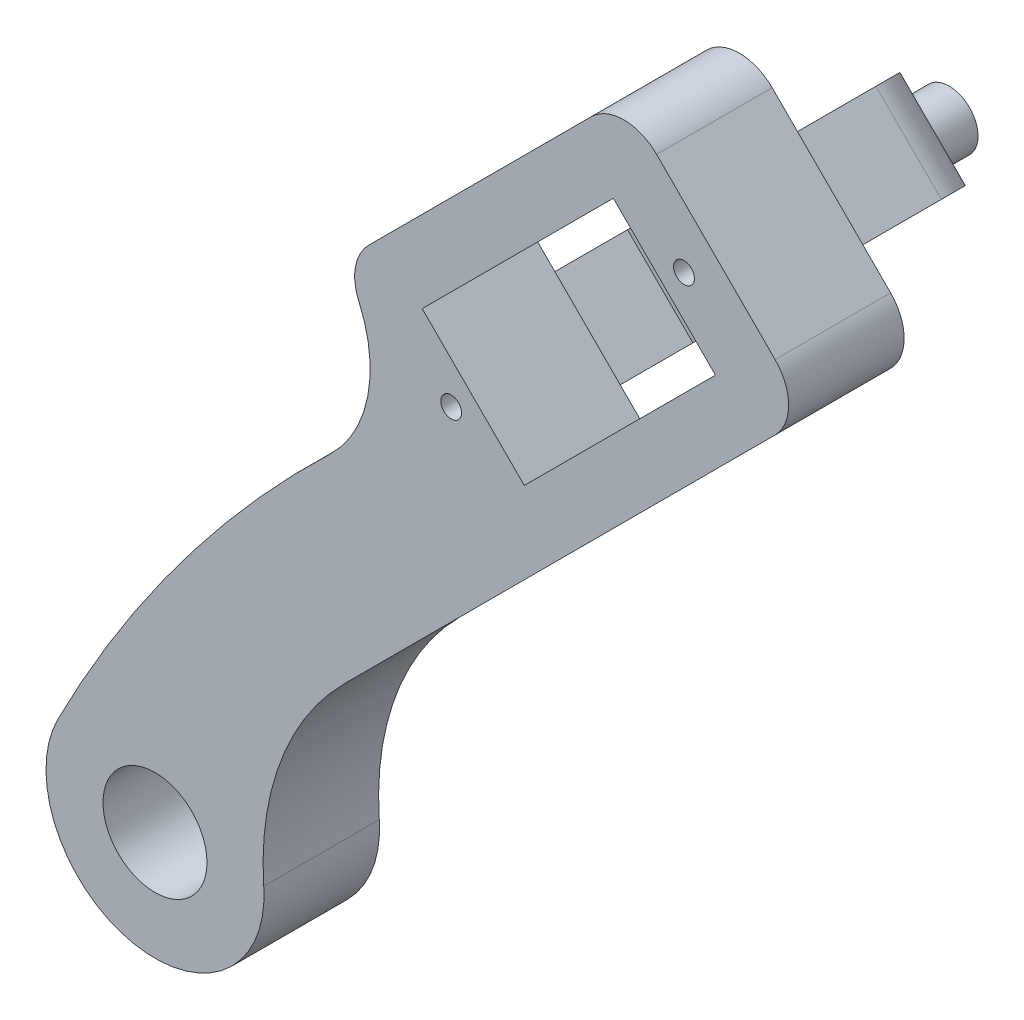
ISO-10303-21;
HEADER;
FILE_DESCRIPTION(('STEP AP214'),'2;1');
FILE_NAME('part.step','',(''),(''),'','','');
FILE_SCHEMA(('AUTOMOTIVE_DESIGN { 1 0 10303 214 1 1 1 1 }'));
ENDSEC;
DATA;
#1=APPLICATION_CONTEXT('core data for automotive mechanical design processes');
#2=APPLICATION_PROTOCOL_DEFINITION('international standard','automotive_design',2000,#1);
#3=PRODUCT_CONTEXT('',#1,'mechanical');
#4=PRODUCT('Part','Part','',(#3));
#5=PRODUCT_RELATED_PRODUCT_CATEGORY('part','',(#4));
#6=PRODUCT_DEFINITION_FORMATION('','',#4);
#7=PRODUCT_DEFINITION_CONTEXT('part definition',#1,'design');
#8=PRODUCT_DEFINITION('design','',#6,#7);
#9=PRODUCT_DEFINITION_SHAPE('','',#8);
#10=(LENGTH_UNIT() NAMED_UNIT(*) SI_UNIT(.MILLI.,.METRE.));
#11=(NAMED_UNIT(*) PLANE_ANGLE_UNIT() SI_UNIT($,.RADIAN.));
#12=(NAMED_UNIT(*) SI_UNIT($,.STERADIAN.) SOLID_ANGLE_UNIT());
#13=UNCERTAINTY_MEASURE_WITH_UNIT(LENGTH_MEASURE(1.E-05),#10,'distance_accuracy_value','');
#14=(GEOMETRIC_REPRESENTATION_CONTEXT(3) GLOBAL_UNCERTAINTY_ASSIGNED_CONTEXT((#13)) GLOBAL_UNIT_ASSIGNED_CONTEXT((#10,
#11,#12)) REPRESENTATION_CONTEXT('',''));
#15=CARTESIAN_POINT('',(0.,0.,0.));
#16=DIRECTION('',(0.,0.,1.));
#17=DIRECTION('',(1.,0.,0.));
#18=AXIS2_PLACEMENT_3D('',#15,#16,#17);
#19=CARTESIAN_POINT('',(24.0811143897357,-32.5956416867762,10.));
#20=DIRECTION('',(0.,0.,-1.));
#21=DIRECTION('',(-1.,0.,0.));
#22=AXIS2_PLACEMENT_3D('',#19,#20,#21);
#23=PLANE('',#22);
#24=CARTESIAN_POINT('',(36.5069999718094,29.9101868637243,10.));
#25=DIRECTION('',(0.,0.,1.));
#26=DIRECTION('',(1.,0.,0.));
#27=AXIS2_PLACEMENT_3D('',#24,#25,#26);
#28=CIRCLE('',#27,0.899999999999996);
#29=CARTESIAN_POINT('',(37.4069999718094,29.9101868637243,10.));
#30=VERTEX_POINT('',#29);
#31=EDGE_CURVE('E846',#30,#30,#28,.T.);
#32=ORIENTED_EDGE('',*,*,#31,.F.);
#33=EDGE_LOOP('',(#32));
#34=FACE_BOUND('',#33,.T.);
#35=CARTESIAN_POINT('',(16.3544567079928,9.75764359990767,10.));
#36=DIRECTION('',(0.,0.,1.));
#37=DIRECTION('',(1.,0.,0.));
#38=AXIS2_PLACEMENT_3D('',#35,#36,#37);
#39=CIRCLE('',#38,0.9);
#40=CARTESIAN_POINT('',(17.2544567079928,9.75764359990767,10.));
#41=VERTEX_POINT('',#40);
#42=EDGE_CURVE('E855',#41,#41,#39,.T.);
#43=ORIENTED_EDGE('',*,*,#42,.F.);
#44=EDGE_LOOP('',(#43));
#45=FACE_BOUND('',#44,.T.);
#46=CARTESIAN_POINT('',(24.0811143897357,-32.5956416867762,10.));
#47=DIRECTION('',(0.,0.,-1.));
#48=DIRECTION('',(-1.,0.,0.));
#49=AXIS2_PLACEMENT_3D('',#46,#47,#48);
#50=CIRCLE('',#49,24.0118672744103);
#51=CARTESIAN_POINT('',(0.129369861392694,-34.2937889280073,10.));
#52=VERTEX_POINT('',#51);
#53=CARTESIAN_POINT('',(7.10216021104856,-15.61668750809,10.));
#54=VERTEX_POINT('',#53);
#55=EDGE_CURVE('E372',#52,#54,#50,.T.);
#56=ORIENTED_EDGE('',*,*,#55,.T.);
#57=DIRECTION('',(0.707106781186546,0.707106781186549,0.));
#58=VECTOR('',#57,1.);
#59=CARTESIAN_POINT('',(7.10216021104856,-15.61668750809,10.));
#60=LINE('',#59,#58);
#61=CARTESIAN_POINT('',(44.3912405820395,21.6723928629011,10.));
#62=VERTEX_POINT('',#61);
#63=EDGE_CURVE('E376',#54,#62,#60,.T.);
#64=ORIENTED_EDGE('',*,*,#63,.T.);
#65=CARTESIAN_POINT('',(41.5628134572933,24.5008199876474,10.));
#66=DIRECTION('',(0.,0.,1.));
#67=DIRECTION('',(1.,0.,0.));
#68=AXIS2_PLACEMENT_3D('',#65,#66,#67);
#69=CIRCLE('',#68,3.9999999999999);
#70=CARTESIAN_POINT('',(44.3912405820395,27.3292471123935,10.));
#71=VERTEX_POINT('',#70);
#72=EDGE_CURVE('E380',#62,#71,#69,.T.);
#73=ORIENTED_EDGE('',*,*,#72,.T.);
#74=DIRECTION('',(-0.707106781186549,0.707106781186546,0.));
#75=VECTOR('',#74,1.);
#76=CARTESIAN_POINT('',(44.3912405820394,27.3292471123934,10.));
#77=LINE('',#76,#75);
#78=CARTESIAN_POINT('',(34.1381922548344,37.5822954395984,10.));
#79=VERTEX_POINT('',#78);
#80=EDGE_CURVE('E383',#71,#79,#77,.T.);
#81=ORIENTED_EDGE('',*,*,#80,.T.);
#82=CARTESIAN_POINT('',(31.3097651300883,34.7538683148522,10.));
#83=DIRECTION('',(0.,0.,1.));
#84=DIRECTION('',(1.,0.,0.));
#85=AXIS2_PLACEMENT_3D('',#82,#83,#84);
#86=CIRCLE('',#85,3.99999999999996);
#87=CARTESIAN_POINT('',(28.481338005342,37.5822954395983,10.));
#88=VERTEX_POINT('',#87);
#89=EDGE_CURVE('E386',#79,#88,#86,.T.);
#90=ORIENTED_EDGE('',*,*,#89,.T.);
#91=DIRECTION('',(-0.707106781186546,-0.707106781186549,0.));
#92=VECTOR('',#91,1.);
#93=CARTESIAN_POINT('',(28.481338005342,37.5822954395983,10.));
#94=LINE('',#93,#92);
#95=CARTESIAN_POINT('',(9.21539039948496,18.3163478337412,10.));
#96=VERTEX_POINT('',#95);
#97=EDGE_CURVE('E389',#88,#96,#94,.T.);
#98=ORIENTED_EDGE('',*,*,#97,.T.);
#99=CARTESIAN_POINT('',(12.1521017138168,15.3796365194093,10.));
#100=DIRECTION('',(0.,0.,1.));
#101=DIRECTION('',(1.,0.,0.));
#102=AXIS2_PLACEMENT_3D('',#99,#100,#101);
#103=CIRCLE('',#102,4.15313696950266);
#104=CARTESIAN_POINT('',(8.36213667163491,13.6811926238129,10.));
#105=VERTEX_POINT('',#104);
#106=EDGE_CURVE('E392',#96,#105,#103,.T.);
#107=ORIENTED_EDGE('',*,*,#106,.T.);
#108=CARTESIAN_POINT('',(-1.86752605487324,9.09684738092259,10.));
#109=DIRECTION('',(0.,0.,-1.));
#110=DIRECTION('',(-1.,0.,0.));
#111=AXIS2_PLACEMENT_3D('',#108,#109,#110);
#112=CIRCLE('',#111,11.2099161818509);
#113=CARTESIAN_POINT('',(5.88617447944661,1.00102445621569,10.));
#114=VERTEX_POINT('',#113);
#115=EDGE_CURVE('E395',#105,#114,#112,.T.);
#116=ORIENTED_EDGE('',*,*,#115,.T.);
#117=CARTESIAN_POINT('',(87.9841446707318,-84.7194165389705,10.));
#118=DIRECTION('',(0.,0.,1.));
#119=DIRECTION('',(1.,0.,0.));
#120=AXIS2_PLACEMENT_3D('',#117,#118,#119);
#121=CIRCLE('',#120,118.693178885471);
#122=CARTESIAN_POINT('',(-17.6852254719046,-30.6633814679737,10.));
#123=VERTEX_POINT('',#122);
#124=EDGE_CURVE('E398',#114,#123,#121,.T.);
#125=ORIENTED_EDGE('',*,*,#124,.T.);
#126=CARTESIAN_POINT('',(-9.28385052519776,-34.9611738949632,10.));
#127=DIRECTION('',(0.,0.,1.));
#128=DIRECTION('',(1.,0.,0.));
#129=AXIS2_PLACEMENT_3D('',#126,#127,#128);
#130=CIRCLE('',#129,9.43684908964008);
#131=EDGE_CURVE('E401',#123,#52,#130,.T.);
#132=ORIENTED_EDGE('',*,*,#131,.T.);
#133=EDGE_LOOP('',(#56,#64,#73,#81,#90,#98,#107,#116,#125,#132));
#134=FACE_BOUND('',#133,.T.);
#135=DIRECTION('',(-0.707106781186549,0.707106781186546,0.));
#136=VECTOR('',#135,1.);
#137=CARTESIAN_POINT('',(39.2293610793776,23.5815811721047,10.));
#138=LINE('',#137,#136);
#139=CARTESIAN_POINT('',(39.2293610793776,23.5815811721047,10.));
#140=VERTEX_POINT('',#139);
#141=CARTESIAN_POINT('',(30.3905263145457,32.4204159369365,10.));
#142=VERTEX_POINT('',#141);
#143=EDGE_CURVE('E329',#140,#142,#138,.T.);
#144=ORIENTED_EDGE('',*,*,#143,.F.);
#145=DIRECTION('',(0.707106781186546,0.707106781186549,0.));
#146=VECTOR('',#145,1.);
#147=CARTESIAN_POINT('',(39.2293610793776,23.5815811721047,10.));
#148=LINE('',#147,#146);
#149=CARTESIAN_POINT('',(22.6830623996124,7.03528249233946,10.));
#150=VERTEX_POINT('',#149);
#151=EDGE_CURVE('E340',#150,#140,#148,.T.);
#152=ORIENTED_EDGE('',*,*,#151,.F.);
#153=DIRECTION('',(0.707106781186549,-0.707106781186546,0.));
#154=VECTOR('',#153,1.);
#155=CARTESIAN_POINT('',(22.6830623996124,7.03528249233946,10.));
#156=LINE('',#155,#154);
#157=CARTESIAN_POINT('',(13.8442276347806,15.8741172571713,10.));
#158=VERTEX_POINT('',#157);
#159=EDGE_CURVE('E336',#158,#150,#156,.T.);
#160=ORIENTED_EDGE('',*,*,#159,.F.);
#161=DIRECTION('',(-0.707106781186546,-0.707106781186549,0.));
#162=VECTOR('',#161,1.);
#163=CARTESIAN_POINT('',(30.3905263145457,32.4204159369365,10.));
#164=LINE('',#163,#162);
#165=EDGE_CURVE('E332',#142,#158,#164,.T.);
#166=ORIENTED_EDGE('',*,*,#165,.F.);
#167=EDGE_LOOP('',(#144,#152,#160,#166));
#168=FACE_BOUND('',#167,.T.);
#169=CARTESIAN_POINT('',(-9.28385052519776,-34.9611738949632,10.));
#170=DIRECTION('',(0.,0.,1.));
#171=DIRECTION('',(1.,0.,0.));
#172=AXIS2_PLACEMENT_3D('',#169,#170,#171);
#173=CIRCLE('',#172,4.5);
#174=CARTESIAN_POINT('',(-4.78385052519776,-34.9611738949632,10.));
#175=VERTEX_POINT('',#174);
#176=EDGE_CURVE('E321',#175,#175,#173,.T.);
#177=ORIENTED_EDGE('',*,*,#176,.F.);
#178=EDGE_LOOP('',(#177));
#179=FACE_BOUND('',#178,.T.);
#180=ADVANCED_FACE('F41',(#34,#45,#134,#168,#179),#23,.F.);
#181=CARTESIAN_POINT('',(24.0811143897357,-32.5956416867762,0.));
#182=DIRECTION('',(0.,0.,-1.));
#183=DIRECTION('',(-1.,0.,0.));
#184=AXIS2_PLACEMENT_3D('',#181,#182,#183);
#185=PLANE('',#184);
#186=DIRECTION('',(0.707106781186546,0.707106781186549,0.));
#187=VECTOR('',#186,1.);
#188=CARTESIAN_POINT('',(6.12683367878881,-6.12683367878878,0.));
#189=LINE('',#188,#187);
#190=CARTESIAN_POINT('',(38.6636756544284,26.4100082968509,0.));
#191=VERTEX_POINT('',#190);
#192=CARTESIAN_POINT('',(40.784995997988,28.5313286404105,0.));
#193=VERTEX_POINT('',#192);
#194=EDGE_CURVE('E235',#191,#193,#189,.T.);
#195=ORIENTED_EDGE('',*,*,#194,.T.);
#196=DIRECTION('',(-0.707106781186549,0.707106781186546,0.));
#197=VECTOR('',#196,1.);
#198=CARTESIAN_POINT('',(40.784995997988,28.5313286404105,0.));
#199=LINE('',#198,#197);
#200=CARTESIAN_POINT('',(35.1281417484956,34.1881828899029,0.));
#201=VERTEX_POINT('',#200);
#202=EDGE_CURVE('E218',#193,#201,#199,.T.);
#203=ORIENTED_EDGE('',*,*,#202,.T.);
#204=DIRECTION('',(0.707106781186546,0.707106781186549,0.));
#205=VECTOR('',#204,1.);
#206=CARTESIAN_POINT('',(0.469979429296419,-0.469979429296418,0.));
#207=LINE('',#206,#205);
#208=CARTESIAN_POINT('',(33.006821404936,32.0668625463433,0.));
#209=VERTEX_POINT('',#208);
#210=EDGE_CURVE('E270',#209,#201,#207,.T.);
#211=ORIENTED_EDGE('',*,*,#210,.F.);
#212=DIRECTION('',(-0.707106781186549,0.707106781186546,0.));
#213=VECTOR('',#212,1.);
#214=CARTESIAN_POINT('',(38.6636756544284,26.4100082968509,0.));
#215=LINE('',#214,#213);
#216=EDGE_CURVE('E316',#191,#209,#215,.T.);
#217=ORIENTED_EDGE('',*,*,#216,.F.);
#218=EDGE_LOOP('',(#195,#203,#211,#217));
#219=FACE_BOUND('',#218,.T.);
#220=DIRECTION('',(-0.707106781186546,-0.707106781186549,0.));
#221=VECTOR('',#220,1.);
#222=CARTESIAN_POINT('',(6.12683367878881,-6.12683367878878,0.));
#223=LINE('',#222,#221);
#224=CARTESIAN_POINT('',(20.2788993435782,8.02523198600062,0.));
#225=VERTEX_POINT('',#224);
#226=CARTESIAN_POINT('',(18.1575790000185,5.90391164244098,0.));
#227=VERTEX_POINT('',#226);
#228=EDGE_CURVE('E250',#225,#227,#223,.T.);
#229=ORIENTED_EDGE('',*,*,#228,.F.);
#230=DIRECTION('',(-0.707106781186549,0.707106781186546,0.));
#231=VECTOR('',#230,1.);
#232=CARTESIAN_POINT('',(20.2788993435782,8.02523198600062,0.));
#233=LINE('',#232,#231);
#234=CARTESIAN_POINT('',(14.6220450940858,13.682086235493,0.));
#235=VERTEX_POINT('',#234);
#236=EDGE_CURVE('E304',#225,#235,#233,.T.);
#237=ORIENTED_EDGE('',*,*,#236,.T.);
#238=DIRECTION('',(-0.707106781186546,-0.707106781186549,0.));
#239=VECTOR('',#238,1.);
#240=CARTESIAN_POINT('',(0.469979429296419,-0.469979429296418,0.));
#241=LINE('',#240,#239);
#242=CARTESIAN_POINT('',(12.5007247505261,11.5607658919333,0.));
#243=VERTEX_POINT('',#242);
#244=EDGE_CURVE('E281',#235,#243,#241,.T.);
#245=ORIENTED_EDGE('',*,*,#244,.T.);
#246=DIRECTION('',(-0.707106781186549,0.707106781186546,0.));
#247=VECTOR('',#246,1.);
#248=CARTESIAN_POINT('',(18.1575790000185,5.90391164244098,0.));
#249=LINE('',#248,#247);
#250=EDGE_CURVE('E301',#227,#243,#249,.T.);
#251=ORIENTED_EDGE('',*,*,#250,.F.);
#252=EDGE_LOOP('',(#229,#237,#245,#251));
#253=FACE_BOUND('',#252,.T.);
#254=DIRECTION('',(0.707106781186546,0.707106781186549,0.));
#255=VECTOR('',#254,1.);
#256=CARTESIAN_POINT('',(39.2293610793776,23.5815811721047,0.));
#257=LINE('',#256,#255);
#258=CARTESIAN_POINT('',(22.6830623996124,7.03528249233946,0.));
#259=VERTEX_POINT('',#258);
#260=CARTESIAN_POINT('',(39.2293610793776,23.5815811721047,0.));
#261=VERTEX_POINT('',#260);
#262=EDGE_CURVE('E333',#259,#261,#257,.T.);
#263=ORIENTED_EDGE('',*,*,#262,.T.);
#264=DIRECTION('',(-0.707106781186549,0.707106781186546,0.));
#265=VECTOR('',#264,1.);
#266=CARTESIAN_POINT('',(39.2293610793776,23.5815811721047,0.));
#267=LINE('',#266,#265);
#268=CARTESIAN_POINT('',(30.3905263145457,32.4204159369365,0.));
#269=VERTEX_POINT('',#268);
#270=EDGE_CURVE('E325',#261,#269,#267,.T.);
#271=ORIENTED_EDGE('',*,*,#270,.T.);
#272=DIRECTION('',(-0.707106781186546,-0.707106781186549,0.));
#273=VECTOR('',#272,1.);
#274=CARTESIAN_POINT('',(30.3905263145457,32.4204159369365,0.));
#275=LINE('',#274,#273);
#276=CARTESIAN_POINT('',(13.8442276347806,15.8741172571713,0.));
#277=VERTEX_POINT('',#276);
#278=EDGE_CURVE('E347',#269,#277,#275,.T.);
#279=ORIENTED_EDGE('',*,*,#278,.T.);
#280=DIRECTION('',(0.707106781186549,-0.707106781186546,0.));
#281=VECTOR('',#280,1.);
#282=CARTESIAN_POINT('',(22.6830623996124,7.03528249233946,0.));
#283=LINE('',#282,#281);
#284=EDGE_CURVE('E351',#277,#259,#283,.T.);
#285=ORIENTED_EDGE('',*,*,#284,.T.);
#286=EDGE_LOOP('',(#263,#271,#279,#285));
#287=FACE_BOUND('',#286,.T.);
#288=CARTESIAN_POINT('',(24.0811143897357,-32.5956416867762,0.));
#289=DIRECTION('',(0.,0.,-1.));
#290=DIRECTION('',(-1.,0.,0.));
#291=AXIS2_PLACEMENT_3D('',#288,#289,#290);
#292=CIRCLE('',#291,24.0118672744103);
#293=CARTESIAN_POINT('',(0.129369861392694,-34.2937889280073,0.));
#294=VERTEX_POINT('',#293);
#295=CARTESIAN_POINT('',(7.10216021104856,-15.61668750809,0.));
#296=VERTEX_POINT('',#295);
#297=EDGE_CURVE('E371',#294,#296,#292,.T.);
#298=ORIENTED_EDGE('',*,*,#297,.F.);
#299=CARTESIAN_POINT('',(-9.28385052519776,-34.9611738949632,0.));
#300=DIRECTION('',(0.,0.,1.));
#301=DIRECTION('',(1.,0.,0.));
#302=AXIS2_PLACEMENT_3D('',#299,#300,#301);
#303=CIRCLE('',#302,9.43684908964008);
#304=CARTESIAN_POINT('',(-17.6852254719046,-30.6633814679737,0.));
#305=VERTEX_POINT('',#304);
#306=EDGE_CURVE('E377',#305,#294,#303,.T.);
#307=ORIENTED_EDGE('',*,*,#306,.F.);
#308=CARTESIAN_POINT('',(87.9841446707318,-84.7194165389705,0.));
#309=DIRECTION('',(0.,0.,1.));
#310=DIRECTION('',(1.,0.,0.));
#311=AXIS2_PLACEMENT_3D('',#308,#309,#310);
#312=CIRCLE('',#311,118.693178885471);
#313=CARTESIAN_POINT('',(5.88617447944661,1.00102445621569,0.));
#314=VERTEX_POINT('',#313);
#315=EDGE_CURVE('E429',#314,#305,#312,.T.);
#316=ORIENTED_EDGE('',*,*,#315,.F.);
#317=CARTESIAN_POINT('',(-1.86752605487324,9.09684738092259,0.));
#318=DIRECTION('',(0.,0.,-1.));
#319=DIRECTION('',(-1.,0.,0.));
#320=AXIS2_PLACEMENT_3D('',#317,#318,#319);
#321=CIRCLE('',#320,11.2099161818509);
#322=CARTESIAN_POINT('',(8.36213667163491,13.6811926238129,0.));
#323=VERTEX_POINT('',#322);
#324=EDGE_CURVE('E426',#323,#314,#321,.T.);
#325=ORIENTED_EDGE('',*,*,#324,.F.);
#326=CARTESIAN_POINT('',(12.1521017138168,15.3796365194093,0.));
#327=DIRECTION('',(0.,0.,1.));
#328=DIRECTION('',(1.,0.,0.));
#329=AXIS2_PLACEMENT_3D('',#326,#327,#328);
#330=CIRCLE('',#329,4.15313696950266);
#331=CARTESIAN_POINT('',(9.21539039948496,18.3163478337412,0.));
#332=VERTEX_POINT('',#331);
#333=EDGE_CURVE('E423',#332,#323,#330,.T.);
#334=ORIENTED_EDGE('',*,*,#333,.F.);
#335=DIRECTION('',(-0.707106781186546,-0.707106781186549,0.));
#336=VECTOR('',#335,1.);
#337=CARTESIAN_POINT('',(28.481338005342,37.5822954395983,0.));
#338=LINE('',#337,#336);
#339=CARTESIAN_POINT('',(28.481338005342,37.5822954395983,0.));
#340=VERTEX_POINT('',#339);
#341=EDGE_CURVE('E420',#340,#332,#338,.T.);
#342=ORIENTED_EDGE('',*,*,#341,.F.);
#343=CARTESIAN_POINT('',(31.3097651300883,34.7538683148522,0.));
#344=DIRECTION('',(0.,0.,1.));
#345=DIRECTION('',(1.,0.,0.));
#346=AXIS2_PLACEMENT_3D('',#343,#344,#345);
#347=CIRCLE('',#346,3.99999999999996);
#348=CARTESIAN_POINT('',(34.1381922548344,37.5822954395984,0.));
#349=VERTEX_POINT('',#348);
#350=EDGE_CURVE('E417',#349,#340,#347,.T.);
#351=ORIENTED_EDGE('',*,*,#350,.F.);
#352=DIRECTION('',(-0.707106781186549,0.707106781186546,0.));
#353=VECTOR('',#352,1.);
#354=CARTESIAN_POINT('',(44.3912405820394,27.3292471123934,0.));
#355=LINE('',#354,#353);
#356=CARTESIAN_POINT('',(44.3912405820395,27.3292471123935,0.));
#357=VERTEX_POINT('',#356);
#358=EDGE_CURVE('E414',#357,#349,#355,.T.);
#359=ORIENTED_EDGE('',*,*,#358,.F.);
#360=CARTESIAN_POINT('',(41.5628134572933,24.5008199876474,0.));
#361=DIRECTION('',(0.,0.,1.));
#362=DIRECTION('',(1.,0.,0.));
#363=AXIS2_PLACEMENT_3D('',#360,#361,#362);
#364=CIRCLE('',#363,3.9999999999999);
#365=CARTESIAN_POINT('',(44.3912405820395,21.6723928629011,0.));
#366=VERTEX_POINT('',#365);
#367=EDGE_CURVE('E411',#366,#357,#364,.T.);
#368=ORIENTED_EDGE('',*,*,#367,.F.);
#369=DIRECTION('',(0.707106781186546,0.707106781186549,0.));
#370=VECTOR('',#369,1.);
#371=CARTESIAN_POINT('',(7.10216021104856,-15.61668750809,0.));
#372=LINE('',#371,#370);
#373=EDGE_CURVE('E408',#296,#366,#372,.T.);
#374=ORIENTED_EDGE('',*,*,#373,.F.);
#375=EDGE_LOOP('',(#298,#307,#316,#325,#334,#342,#351,#359,#368,#374));
#376=FACE_BOUND('',#375,.T.);
#377=CARTESIAN_POINT('',(-9.28385052519776,-34.9611738949632,0.));
#378=DIRECTION('',(0.,0.,1.));
#379=DIRECTION('',(1.,0.,0.));
#380=AXIS2_PLACEMENT_3D('',#377,#378,#379);
#381=CIRCLE('',#380,4.5);
#382=CARTESIAN_POINT('',(-4.78385052519776,-34.9611738949632,0.));
#383=VERTEX_POINT('',#382);
#384=EDGE_CURVE('E217',#383,#383,#381,.T.);
#385=ORIENTED_EDGE('',*,*,#384,.T.);
#386=EDGE_LOOP('',(#385));
#387=FACE_BOUND('',#386,.T.);
#388=ADVANCED_FACE('F482',(#219,#253,#287,#376,#387),#185,.T.);
#389=CARTESIAN_POINT('',(24.0811143897357,-32.5956416867762,10.));
#390=DIRECTION('',(0.,0.,-1.));
#391=DIRECTION('',(-1.,0.,0.));
#392=AXIS2_PLACEMENT_3D('',#389,#390,#391);
#393=CYLINDRICAL_SURFACE('',#392,24.0118672744103);
#394=ORIENTED_EDGE('',*,*,#297,.T.);
#395=DIRECTION('',(0.,0.,-1.));
#396=VECTOR('',#395,1.);
#397=CARTESIAN_POINT('',(7.10216021104856,-15.61668750809,10.));
#398=LINE('',#397,#396);
#399=EDGE_CURVE('E45',#54,#296,#398,.T.);
#400=ORIENTED_EDGE('',*,*,#399,.F.);
#401=ORIENTED_EDGE('',*,*,#55,.F.);
#402=DIRECTION('',(0.,0.,-1.));
#403=VECTOR('',#402,1.);
#404=CARTESIAN_POINT('',(0.129369861392694,-34.2937889280073,10.));
#405=LINE('',#404,#403);
#406=EDGE_CURVE('E404',#52,#294,#405,.T.);
#407=ORIENTED_EDGE('',*,*,#406,.T.);
#408=EDGE_LOOP('',(#394,#400,#401,#407));
#409=FACE_BOUND('',#408,.T.);
#410=ADVANCED_FACE('F43',(#409),#393,.F.);
#411=CARTESIAN_POINT('',(7.10216021104856,-15.61668750809,10.));
#412=DIRECTION('',(-0.707106781186549,0.707106781186546,0.));
#413=DIRECTION('',(-0.707106781186546,-0.707106781186549,0.));
#414=AXIS2_PLACEMENT_3D('',#411,#412,#413);
#415=PLANE('',#414);
#416=ORIENTED_EDGE('',*,*,#373,.T.);
#417=DIRECTION('',(0.,0.,-1.));
#418=VECTOR('',#417,1.);
#419=CARTESIAN_POINT('',(44.3912405820395,21.6723928629011,10.));
#420=LINE('',#419,#418);
#421=EDGE_CURVE('E464',#62,#366,#420,.T.);
#422=ORIENTED_EDGE('',*,*,#421,.F.);
#423=ORIENTED_EDGE('',*,*,#63,.F.);
#424=ORIENTED_EDGE('',*,*,#399,.T.);
#425=EDGE_LOOP('',(#416,#422,#423,#424));
#426=FACE_BOUND('',#425,.T.);
#427=ADVANCED_FACE('F475',(#426),#415,.F.);
#428=CARTESIAN_POINT('',(41.5628134572933,24.5008199876474,10.));
#429=DIRECTION('',(0.,0.,-1.));
#430=DIRECTION('',(-1.,0.,0.));
#431=AXIS2_PLACEMENT_3D('',#428,#429,#430);
#432=CYLINDRICAL_SURFACE('',#431,3.9999999999999);
#433=ORIENTED_EDGE('',*,*,#367,.T.);
#434=DIRECTION('',(0.,0.,-1.));
#435=VECTOR('',#434,1.);
#436=CARTESIAN_POINT('',(44.3912405820395,27.3292471123935,10.));
#437=LINE('',#436,#435);
#438=EDGE_CURVE('E461',#71,#357,#437,.T.);
#439=ORIENTED_EDGE('',*,*,#438,.F.);
#440=ORIENTED_EDGE('',*,*,#72,.F.);
#441=ORIENTED_EDGE('',*,*,#421,.T.);
#442=EDGE_LOOP('',(#433,#439,#440,#441));
#443=FACE_BOUND('',#442,.T.);
#444=ADVANCED_FACE('F488',(#443),#432,.T.);
#445=CARTESIAN_POINT('',(44.3912405820394,27.3292471123934,10.));
#446=DIRECTION('',(-0.707106781186546,-0.707106781186549,0.));
#447=DIRECTION('',(0.707106781186549,-0.707106781186546,0.));
#448=AXIS2_PLACEMENT_3D('',#445,#446,#447);
#449=PLANE('',#448);
#450=ORIENTED_EDGE('',*,*,#358,.T.);
#451=DIRECTION('',(0.,0.,-1.));
#452=VECTOR('',#451,1.);
#453=CARTESIAN_POINT('',(34.1381922548344,37.5822954395984,10.));
#454=LINE('',#453,#452);
#455=EDGE_CURVE('E457',#79,#349,#454,.T.);
#456=ORIENTED_EDGE('',*,*,#455,.F.);
#457=ORIENTED_EDGE('',*,*,#80,.F.);
#458=ORIENTED_EDGE('',*,*,#438,.T.);
#459=EDGE_LOOP('',(#450,#456,#457,#458));
#460=FACE_BOUND('',#459,.T.);
#461=ADVANCED_FACE('F491',(#460),#449,.F.);
#462=CARTESIAN_POINT('',(31.3097651300883,34.7538683148522,10.));
#463=DIRECTION('',(0.,0.,-1.));
#464=DIRECTION('',(-1.,0.,0.));
#465=AXIS2_PLACEMENT_3D('',#462,#463,#464);
#466=CYLINDRICAL_SURFACE('',#465,3.99999999999996);
#467=ORIENTED_EDGE('',*,*,#350,.T.);
#468=DIRECTION('',(0.,0.,-1.));
#469=VECTOR('',#468,1.);
#470=CARTESIAN_POINT('',(28.481338005342,37.5822954395983,10.));
#471=LINE('',#470,#469);
#472=EDGE_CURVE('E453',#88,#340,#471,.T.);
#473=ORIENTED_EDGE('',*,*,#472,.F.);
#474=ORIENTED_EDGE('',*,*,#89,.F.);
#475=ORIENTED_EDGE('',*,*,#455,.T.);
#476=EDGE_LOOP('',(#467,#473,#474,#475));
#477=FACE_BOUND('',#476,.T.);
#478=ADVANCED_FACE('F520',(#477),#466,.T.);
#479=CARTESIAN_POINT('',(28.481338005342,37.5822954395983,10.));
#480=DIRECTION('',(0.707106781186549,-0.707106781186546,0.));
#481=DIRECTION('',(0.707106781186546,0.707106781186549,0.));
#482=AXIS2_PLACEMENT_3D('',#479,#480,#481);
#483=PLANE('',#482);
#484=ORIENTED_EDGE('',*,*,#341,.T.);
#485=DIRECTION('',(0.,0.,-1.));
#486=VECTOR('',#485,1.);
#487=CARTESIAN_POINT('',(9.21539039948496,18.3163478337412,10.));
#488=LINE('',#487,#486);
#489=EDGE_CURVE('E449',#96,#332,#488,.T.);
#490=ORIENTED_EDGE('',*,*,#489,.F.);
#491=ORIENTED_EDGE('',*,*,#97,.F.);
#492=ORIENTED_EDGE('',*,*,#472,.T.);
#493=EDGE_LOOP('',(#484,#490,#491,#492));
#494=FACE_BOUND('',#493,.T.);
#495=ADVANCED_FACE('F518',(#494),#483,.F.);
#496=CARTESIAN_POINT('',(12.1521017138168,15.3796365194093,10.));
#497=DIRECTION('',(0.,0.,-1.));
#498=DIRECTION('',(-1.,0.,0.));
#499=AXIS2_PLACEMENT_3D('',#496,#497,#498);
#500=CYLINDRICAL_SURFACE('',#499,4.15313696950266);
#501=ORIENTED_EDGE('',*,*,#333,.T.);
#502=DIRECTION('',(0.,0.,-1.));
#503=VECTOR('',#502,1.);
#504=CARTESIAN_POINT('',(8.36213667163491,13.6811926238129,10.));
#505=LINE('',#504,#503);
#506=EDGE_CURVE('E445',#105,#323,#505,.T.);
#507=ORIENTED_EDGE('',*,*,#506,.F.);
#508=ORIENTED_EDGE('',*,*,#106,.F.);
#509=ORIENTED_EDGE('',*,*,#489,.T.);
#510=EDGE_LOOP('',(#501,#507,#508,#509));
#511=FACE_BOUND('',#510,.T.);
#512=ADVANCED_FACE('F514',(#511),#500,.T.);
#513=CARTESIAN_POINT('',(-1.86752605487324,9.09684738092259,10.));
#514=DIRECTION('',(0.,0.,-1.));
#515=DIRECTION('',(-1.,0.,0.));
#516=AXIS2_PLACEMENT_3D('',#513,#514,#515);
#517=CYLINDRICAL_SURFACE('',#516,11.2099161818509);
#518=ORIENTED_EDGE('',*,*,#324,.T.);
#519=DIRECTION('',(0.,0.,-1.));
#520=VECTOR('',#519,1.);
#521=CARTESIAN_POINT('',(5.88617447944661,1.00102445621569,10.));
#522=LINE('',#521,#520);
#523=EDGE_CURVE('E441',#114,#314,#522,.T.);
#524=ORIENTED_EDGE('',*,*,#523,.F.);
#525=ORIENTED_EDGE('',*,*,#115,.F.);
#526=ORIENTED_EDGE('',*,*,#506,.T.);
#527=EDGE_LOOP('',(#518,#524,#525,#526));
#528=FACE_BOUND('',#527,.T.);
#529=ADVANCED_FACE('F509',(#528),#517,.F.);
#530=CARTESIAN_POINT('',(87.9841446707318,-84.7194165389705,10.));
#531=DIRECTION('',(0.,0.,-1.));
#532=DIRECTION('',(-1.,0.,0.));
#533=AXIS2_PLACEMENT_3D('',#530,#531,#532);
#534=CYLINDRICAL_SURFACE('',#533,118.693178885471);
#535=ORIENTED_EDGE('',*,*,#315,.T.);
#536=DIRECTION('',(0.,0.,-1.));
#537=VECTOR('',#536,1.);
#538=CARTESIAN_POINT('',(-17.6852254719046,-30.6633814679737,10.));
#539=LINE('',#538,#537);
#540=EDGE_CURVE('E437',#123,#305,#539,.T.);
#541=ORIENTED_EDGE('',*,*,#540,.F.);
#542=ORIENTED_EDGE('',*,*,#124,.F.);
#543=ORIENTED_EDGE('',*,*,#523,.T.);
#544=EDGE_LOOP('',(#535,#541,#542,#543));
#545=FACE_BOUND('',#544,.T.);
#546=ADVANCED_FACE('F503',(#545),#534,.T.);
#547=CARTESIAN_POINT('',(-9.28385052519776,-34.9611738949632,10.));
#548=DIRECTION('',(0.,0.,-1.));
#549=DIRECTION('',(-1.,0.,0.));
#550=AXIS2_PLACEMENT_3D('',#547,#548,#549);
#551=CYLINDRICAL_SURFACE('',#550,9.43684908964008);
#552=ORIENTED_EDGE('',*,*,#306,.T.);
#553=ORIENTED_EDGE('',*,*,#406,.F.);
#554=ORIENTED_EDGE('',*,*,#131,.F.);
#555=ORIENTED_EDGE('',*,*,#540,.T.);
#556=EDGE_LOOP('',(#552,#553,#554,#555));
#557=FACE_BOUND('',#556,.T.);
#558=ADVANCED_FACE('F501',(#557),#551,.T.);
#559=CARTESIAN_POINT('',(39.2293610793776,23.5815811721047,10.));
#560=DIRECTION('',(-0.707106781186546,-0.707106781186549,0.));
#561=DIRECTION('',(0.707106781186549,-0.707106781186546,0.));
#562=AXIS2_PLACEMENT_3D('',#559,#560,#561);
#563=PLANE('',#562);
#564=ORIENTED_EDGE('',*,*,#270,.F.);
#565=DIRECTION('',(0.,0.,-1.));
#566=VECTOR('',#565,1.);
#567=CARTESIAN_POINT('',(39.2293610793776,23.5815811721047,10.));
#568=LINE('',#567,#566);
#569=EDGE_CURVE('E343',#140,#261,#568,.T.);
#570=ORIENTED_EDGE('',*,*,#569,.F.);
#571=ORIENTED_EDGE('',*,*,#143,.T.);
#572=DIRECTION('',(0.,0.,-1.));
#573=VECTOR('',#572,1.);
#574=CARTESIAN_POINT('',(30.3905263145457,32.4204159369365,10.));
#575=LINE('',#574,#573);
#576=EDGE_CURVE('E367',#142,#269,#575,.T.);
#577=ORIENTED_EDGE('',*,*,#576,.T.);
#578=EDGE_LOOP('',(#564,#570,#571,#577));
#579=FACE_BOUND('',#578,.T.);
#580=ADVANCED_FACE('F540',(#579),#563,.T.);
#581=CARTESIAN_POINT('',(30.3905263145457,32.4204159369365,10.));
#582=DIRECTION('',(0.707106781186549,-0.707106781186546,0.));
#583=DIRECTION('',(0.707106781186546,0.707106781186549,0.));
#584=AXIS2_PLACEMENT_3D('',#581,#582,#583);
#585=PLANE('',#584);
#586=ORIENTED_EDGE('',*,*,#278,.F.);
#587=ORIENTED_EDGE('',*,*,#576,.F.);
#588=ORIENTED_EDGE('',*,*,#165,.T.);
#589=DIRECTION('',(0.,0.,-1.));
#590=VECTOR('',#589,1.);
#591=CARTESIAN_POINT('',(13.8442276347806,15.8741172571713,10.));
#592=LINE('',#591,#590);
#593=EDGE_CURVE('E364',#158,#277,#592,.T.);
#594=ORIENTED_EDGE('',*,*,#593,.T.);
#595=EDGE_LOOP('',(#586,#587,#588,#594));
#596=FACE_BOUND('',#595,.T.);
#597=ADVANCED_FACE('F572',(#596),#585,.T.);
#598=CARTESIAN_POINT('',(22.6830623996124,7.03528249233946,10.));
#599=DIRECTION('',(0.707106781186546,0.707106781186549,0.));
#600=DIRECTION('',(-0.707106781186549,0.707106781186546,0.));
#601=AXIS2_PLACEMENT_3D('',#598,#599,#600);
#602=PLANE('',#601);
#603=ORIENTED_EDGE('',*,*,#284,.F.);
#604=ORIENTED_EDGE('',*,*,#593,.F.);
#605=ORIENTED_EDGE('',*,*,#159,.T.);
#606=DIRECTION('',(0.,0.,-1.));
#607=VECTOR('',#606,1.);
#608=CARTESIAN_POINT('',(22.6830623996124,7.03528249233946,10.));
#609=LINE('',#608,#607);
#610=EDGE_CURVE('E361',#150,#259,#609,.T.);
#611=ORIENTED_EDGE('',*,*,#610,.T.);
#612=EDGE_LOOP('',(#603,#604,#605,#611));
#613=FACE_BOUND('',#612,.T.);
#614=ADVANCED_FACE('F579',(#613),#602,.T.);
#615=CARTESIAN_POINT('',(39.2293610793776,23.5815811721047,10.));
#616=DIRECTION('',(-0.707106781186549,0.707106781186546,0.));
#617=DIRECTION('',(-0.707106781186546,-0.707106781186549,0.));
#618=AXIS2_PLACEMENT_3D('',#615,#616,#617);
#619=PLANE('',#618);
#620=ORIENTED_EDGE('',*,*,#262,.F.);
#621=ORIENTED_EDGE('',*,*,#610,.F.);
#622=ORIENTED_EDGE('',*,*,#151,.T.);
#623=ORIENTED_EDGE('',*,*,#569,.T.);
#624=EDGE_LOOP('',(#620,#621,#622,#623));
#625=FACE_BOUND('',#624,.T.);
#626=ADVANCED_FACE('F586',(#625),#619,.T.);
#627=CARTESIAN_POINT('',(-9.28385052519776,-34.9611738949632,10.));
#628=DIRECTION('',(0.,0.,-1.));
#629=DIRECTION('',(-1.,0.,0.));
#630=AXIS2_PLACEMENT_3D('',#627,#628,#629);
#631=CYLINDRICAL_SURFACE('',#630,4.5);
#632=ORIENTED_EDGE('',*,*,#176,.T.);
#633=EDGE_LOOP('',(#632));
#634=FACE_BOUND('',#633,.T.);
#635=ORIENTED_EDGE('',*,*,#384,.F.);
#636=EDGE_LOOP('',(#635));
#637=FACE_BOUND('',#636,.T.);
#638=ADVANCED_FACE('F594',(#634,#637),#631,.F.);
#639=CARTESIAN_POINT('',(37.9565688732418,25.7029015156644,-8.));
#640=DIRECTION('',(-0.707106781186549,0.707106781186546,0.));
#641=DIRECTION('',(-0.707106781186546,-0.707106781186549,0.));
#642=AXIS2_PLACEMENT_3D('',#639,#640,#641);
#643=CYLINDRICAL_SURFACE('',#642,4.);
#644=CARTESIAN_POINT('',(32.2997146237494,31.3597557651567,-8.));
#645=DIRECTION('',(0.707106781186549,-0.707106781186546,0.));
#646=DIRECTION('',(0.707106781186546,0.707106781186549,0.));
#647=AXIS2_PLACEMENT_3D('',#644,#645,#646);
#648=CIRCLE('',#647,4.);
#649=CARTESIAN_POINT('',(35.1281417484956,34.1881828899029,-8.));
#650=VERTEX_POINT('',#649);
#651=CARTESIAN_POINT('',(32.2997146237494,31.3597557651567,-12.));
#652=VERTEX_POINT('',#651);
#653=EDGE_CURVE('E212',#650,#652,#648,.F.);
#654=ORIENTED_EDGE('',*,*,#653,.F.);
#655=DIRECTION('',(-0.707106781186549,0.707106781186546,0.));
#656=VECTOR('',#655,1.);
#657=CARTESIAN_POINT('',(40.784995997988,28.5313286404105,-8.));
#658=LINE('',#657,#656);
#659=CARTESIAN_POINT('',(40.784995997988,28.5313286404105,-8.));
#660=VERTEX_POINT('',#659);
#661=EDGE_CURVE('E206',#660,#650,#658,.T.);
#662=ORIENTED_EDGE('',*,*,#661,.F.);
#663=CARTESIAN_POINT('',(37.9565688732418,25.7029015156644,-8.));
#664=DIRECTION('',(0.707106781186549,-0.707106781186546,0.));
#665=DIRECTION('',(0.707106781186546,0.707106781186549,0.));
#666=AXIS2_PLACEMENT_3D('',#663,#664,#665);
#667=CIRCLE('',#666,4.);
#668=CARTESIAN_POINT('',(37.9565688732418,25.7029015156644,-12.));
#669=VERTEX_POINT('',#668);
#670=EDGE_CURVE('E209',#660,#669,#667,.F.);
#671=ORIENTED_EDGE('',*,*,#670,.T.);
#672=DIRECTION('',(-0.707106781186549,0.707106781186546,0.));
#673=VECTOR('',#672,1.);
#674=CARTESIAN_POINT('',(37.9565688732418,25.7029015156644,-12.));
#675=LINE('',#674,#673);
#676=EDGE_CURVE('E263',#669,#652,#675,.T.);
#677=ORIENTED_EDGE('',*,*,#676,.T.);
#678=EDGE_LOOP('',(#654,#662,#671,#677));
#679=FACE_BOUND('',#678,.T.);
#680=ADVANCED_FACE('F208',(#679),#643,.T.);
#681=CARTESIAN_POINT('',(40.784995997988,28.5313286404105,0.));
#682=DIRECTION('',(0.707106781186546,0.707106781186549,0.));
#683=DIRECTION('',(-0.707106781186549,0.707106781186546,0.));
#684=AXIS2_PLACEMENT_3D('',#681,#682,#683);
#685=PLANE('',#684);
#686=DIRECTION('',(0.,0.,-1.));
#687=VECTOR('',#686,1.);
#688=CARTESIAN_POINT('',(35.1281417484956,34.1881828899029,0.));
#689=LINE('',#688,#687);
#690=EDGE_CURVE('E266',#201,#650,#689,.T.);
#691=ORIENTED_EDGE('',*,*,#690,.F.);
#692=ORIENTED_EDGE('',*,*,#202,.F.);
#693=DIRECTION('',(0.,0.,-1.));
#694=VECTOR('',#693,1.);
#695=CARTESIAN_POINT('',(40.784995997988,28.5313286404105,0.));
#696=LINE('',#695,#694);
#697=EDGE_CURVE('E224',#193,#660,#696,.T.);
#698=ORIENTED_EDGE('',*,*,#697,.T.);
#699=ORIENTED_EDGE('',*,*,#661,.T.);
#700=EDGE_LOOP('',(#691,#692,#698,#699));
#701=FACE_BOUND('',#700,.T.);
#702=ADVANCED_FACE('F232',(#701),#685,.T.);
#703=CARTESIAN_POINT('',(38.6636756544284,26.4100082968509,0.));
#704=DIRECTION('',(0.707106781186546,0.707106781186549,0.));
#705=DIRECTION('',(-0.707106781186549,0.707106781186546,0.));
#706=AXIS2_PLACEMENT_3D('',#703,#704,#705);
#707=PLANE('',#706);
#708=DIRECTION('',(0.,0.,-1.));
#709=VECTOR('',#708,1.);
#710=CARTESIAN_POINT('',(33.006821404936,32.0668625463433,0.));
#711=LINE('',#710,#709);
#712=CARTESIAN_POINT('',(33.006821404936,32.0668625463433,-6.99999999999999));
#713=VERTEX_POINT('',#712);
#714=EDGE_CURVE('E58',#209,#713,#711,.T.);
#715=ORIENTED_EDGE('',*,*,#714,.T.);
#716=DIRECTION('',(-0.707106781186549,0.707106781186546,0.));
#717=VECTOR('',#716,1.);
#718=CARTESIAN_POINT('',(38.6636756544284,26.4100082968509,-6.99999999999999));
#719=LINE('',#718,#717);
#720=CARTESIAN_POINT('',(38.6636756544284,26.4100082968509,-6.99999999999999));
#721=VERTEX_POINT('',#720);
#722=EDGE_CURVE('E312',#721,#713,#719,.T.);
#723=ORIENTED_EDGE('',*,*,#722,.F.);
#724=DIRECTION('',(0.,0.,-1.));
#725=VECTOR('',#724,1.);
#726=CARTESIAN_POINT('',(38.6636756544284,26.4100082968509,0.));
#727=LINE('',#726,#725);
#728=EDGE_CURVE('E238',#191,#721,#727,.T.);
#729=ORIENTED_EDGE('',*,*,#728,.F.);
#730=ORIENTED_EDGE('',*,*,#216,.T.);
#731=EDGE_LOOP('',(#715,#723,#729,#730));
#732=FACE_BOUND('',#731,.T.);
#733=ADVANCED_FACE('F616',(#732),#707,.F.);
#734=CARTESIAN_POINT('',(6.12683367878881,-6.12683367878878,-7.00000000000001));
#735=DIRECTION('',(0.,0.,-1.));
#736=DIRECTION('',(0.,1.,0.));
#737=AXIS2_PLACEMENT_3D('',#734,#735,#736);
#738=PLANE('',#737);
#739=DIRECTION('',(-0.707106781186546,-0.707106781186549,0.));
#740=VECTOR('',#739,1.);
#741=CARTESIAN_POINT('',(0.469979429296421,-0.469979429296416,-7.00000000000001));
#742=LINE('',#741,#740);
#743=CARTESIAN_POINT('',(14.6220450940858,13.682086235493,-7.));
#744=VERTEX_POINT('',#743);
#745=EDGE_CURVE('E275',#713,#744,#742,.T.);
#746=ORIENTED_EDGE('',*,*,#745,.T.);
#747=DIRECTION('',(-0.707106781186549,0.707106781186546,0.));
#748=VECTOR('',#747,1.);
#749=CARTESIAN_POINT('',(20.2788993435782,8.02523198600062,-7.));
#750=LINE('',#749,#748);
#751=CARTESIAN_POINT('',(20.2788993435782,8.02523198600062,-7.));
#752=VERTEX_POINT('',#751);
#753=EDGE_CURVE('E308',#752,#744,#750,.T.);
#754=ORIENTED_EDGE('',*,*,#753,.F.);
#755=DIRECTION('',(-0.707106781186546,-0.707106781186549,0.));
#756=VECTOR('',#755,1.);
#757=CARTESIAN_POINT('',(6.12683367878881,-6.12683367878878,-7.00000000000001));
#758=LINE('',#757,#756);
#759=EDGE_CURVE('E244',#721,#752,#758,.T.);
#760=ORIENTED_EDGE('',*,*,#759,.F.);
#761=ORIENTED_EDGE('',*,*,#722,.T.);
#762=EDGE_LOOP('',(#746,#754,#760,#761));
#763=FACE_BOUND('',#762,.T.);
#764=ADVANCED_FACE('F623',(#763),#738,.F.);
#765=CARTESIAN_POINT('',(20.2788993435782,8.02523198600062,0.));
#766=DIRECTION('',(-0.707106781186546,-0.707106781186549,0.));
#767=DIRECTION('',(0.707106781186549,-0.707106781186546,0.));
#768=AXIS2_PLACEMENT_3D('',#765,#766,#767);
#769=PLANE('',#768);
#770=DIRECTION('',(0.,0.,1.));
#771=VECTOR('',#770,1.);
#772=CARTESIAN_POINT('',(14.6220450940858,13.682086235493,0.));
#773=LINE('',#772,#771);
#774=EDGE_CURVE('E278',#744,#235,#773,.T.);
#775=ORIENTED_EDGE('',*,*,#774,.T.);
#776=ORIENTED_EDGE('',*,*,#236,.F.);
#777=DIRECTION('',(0.,0.,1.));
#778=VECTOR('',#777,1.);
#779=CARTESIAN_POINT('',(20.2788993435782,8.02523198600062,0.));
#780=LINE('',#779,#778);
#781=EDGE_CURVE('E247',#752,#225,#780,.T.);
#782=ORIENTED_EDGE('',*,*,#781,.F.);
#783=ORIENTED_EDGE('',*,*,#753,.T.);
#784=EDGE_LOOP('',(#775,#776,#782,#783));
#785=FACE_BOUND('',#784,.T.);
#786=ADVANCED_FACE('F631',(#785),#769,.F.);
#787=CARTESIAN_POINT('',(18.1575790000185,5.90391164244098,0.));
#788=DIRECTION('',(-0.707106781186546,-0.707106781186549,0.));
#789=DIRECTION('',(0.707106781186549,-0.707106781186546,0.));
#790=AXIS2_PLACEMENT_3D('',#787,#788,#789);
#791=PLANE('',#790);
#792=DIRECTION('',(0.,0.,1.));
#793=VECTOR('',#792,1.);
#794=CARTESIAN_POINT('',(12.5007247505261,11.5607658919333,0.));
#795=LINE('',#794,#793);
#796=CARTESIAN_POINT('',(12.5007247505261,11.5607658919333,-8.));
#797=VERTEX_POINT('',#796);
#798=EDGE_CURVE('E65',#797,#243,#795,.T.);
#799=ORIENTED_EDGE('',*,*,#798,.F.);
#800=DIRECTION('',(-0.707106781186549,0.707106781186546,0.));
#801=VECTOR('',#800,1.);
#802=CARTESIAN_POINT('',(18.1575790000185,5.90391164244098,-8.));
#803=LINE('',#802,#801);
#804=CARTESIAN_POINT('',(18.1575790000185,5.90391164244098,-8.));
#805=VERTEX_POINT('',#804);
#806=EDGE_CURVE('E298',#805,#797,#803,.T.);
#807=ORIENTED_EDGE('',*,*,#806,.F.);
#808=DIRECTION('',(0.,0.,1.));
#809=VECTOR('',#808,1.);
#810=CARTESIAN_POINT('',(18.1575790000185,5.90391164244098,0.));
#811=LINE('',#810,#809);
#812=EDGE_CURVE('E253',#805,#227,#811,.T.);
#813=ORIENTED_EDGE('',*,*,#812,.T.);
#814=ORIENTED_EDGE('',*,*,#250,.T.);
#815=EDGE_LOOP('',(#799,#807,#813,#814));
#816=FACE_BOUND('',#815,.T.);
#817=ADVANCED_FACE('F639',(#816),#791,.T.);
#818=CARTESIAN_POINT('',(20.9860061247647,8.73233876718717,-8.));
#819=DIRECTION('',(-0.707106781186549,0.707106781186546,0.));
#820=DIRECTION('',(-0.707106781186546,-0.707106781186549,0.));
#821=AXIS2_PLACEMENT_3D('',#818,#819,#820);
#822=CYLINDRICAL_SURFACE('',#821,4.);
#823=CARTESIAN_POINT('',(15.3291518752723,14.3891930166795,-8.));
#824=DIRECTION('',(0.707106781186549,-0.707106781186546,0.));
#825=DIRECTION('',(0.707106781186546,0.707106781186549,0.));
#826=AXIS2_PLACEMENT_3D('',#823,#824,#825);
#827=CIRCLE('',#826,4.);
#828=CARTESIAN_POINT('',(15.3291518752723,14.3891930166795,-12.));
#829=VERTEX_POINT('',#828);
#830=EDGE_CURVE('E287',#829,#797,#827,.F.);
#831=ORIENTED_EDGE('',*,*,#830,.F.);
#832=DIRECTION('',(-0.707106781186549,0.707106781186546,0.));
#833=VECTOR('',#832,1.);
#834=CARTESIAN_POINT('',(20.9860061247647,8.73233876718717,-12.));
#835=LINE('',#834,#833);
#836=CARTESIAN_POINT('',(20.9860061247647,8.73233876718717,-12.));
#837=VERTEX_POINT('',#836);
#838=EDGE_CURVE('E295',#837,#829,#835,.T.);
#839=ORIENTED_EDGE('',*,*,#838,.F.);
#840=CARTESIAN_POINT('',(20.9860061247647,8.73233876718717,-8.));
#841=DIRECTION('',(0.707106781186549,-0.707106781186546,0.));
#842=DIRECTION('',(0.707106781186546,0.707106781186549,0.));
#843=AXIS2_PLACEMENT_3D('',#840,#841,#842);
#844=CIRCLE('',#843,4.);
#845=EDGE_CURVE('E257',#837,#805,#844,.F.);
#846=ORIENTED_EDGE('',*,*,#845,.T.);
#847=ORIENTED_EDGE('',*,*,#806,.T.);
#848=EDGE_LOOP('',(#831,#839,#846,#847));
#849=FACE_BOUND('',#848,.T.);
#850=ADVANCED_FACE('F647',(#849),#822,.T.);
#851=CARTESIAN_POINT('',(6.12683367878881,-6.12683367878878,-12.));
#852=DIRECTION('',(0.,0.,-1.));
#853=DIRECTION('',(0.,1.,0.));
#854=AXIS2_PLACEMENT_3D('',#851,#852,#853);
#855=PLANE('',#854);
#856=CARTESIAN_POINT('',(30.4612369926644,23.8644238845793,-12.));
#857=DIRECTION('',(0.,0.,-1.));
#858=DIRECTION('',(-1.,0.,0.));
#859=AXIS2_PLACEMENT_3D('',#856,#857,#858);
#860=CIRCLE('',#859,3.00000000000004);
#861=CARTESIAN_POINT('',(27.4612369926644,23.8644238845793,-12.));
#862=VERTEX_POINT('',#861);
#863=EDGE_CURVE('E861',#862,#862,#860,.T.);
#864=ORIENTED_EDGE('',*,*,#863,.F.);
#865=EDGE_LOOP('',(#864));
#866=FACE_BOUND('',#865,.T.);
#867=DIRECTION('',(-0.707106781186546,-0.707106781186549,0.));
#868=VECTOR('',#867,1.);
#869=CARTESIAN_POINT('',(0.469979429296419,-0.469979429296417,-12.));
#870=LINE('',#869,#868);
#871=EDGE_CURVE('E230',#652,#829,#870,.T.);
#872=ORIENTED_EDGE('',*,*,#871,.F.);
#873=ORIENTED_EDGE('',*,*,#676,.F.);
#874=DIRECTION('',(-0.707106781186546,-0.707106781186549,0.));
#875=VECTOR('',#874,1.);
#876=CARTESIAN_POINT('',(6.12683367878881,-6.12683367878878,-12.));
#877=LINE('',#876,#875);
#878=EDGE_CURVE('E228',#669,#837,#877,.T.);
#879=ORIENTED_EDGE('',*,*,#878,.T.);
#880=ORIENTED_EDGE('',*,*,#838,.T.);
#881=EDGE_LOOP('',(#872,#873,#879,#880));
#882=FACE_BOUND('',#881,.T.);
#883=ADVANCED_FACE('F655',(#866,#882),#855,.T.);
#884=CARTESIAN_POINT('',(6.12683367878881,-6.12683367878878,0.));
#885=DIRECTION('',(0.707106781186549,-0.707106781186546,0.));
#886=DIRECTION('',(0.707106781186546,0.707106781186549,0.));
#887=AXIS2_PLACEMENT_3D('',#884,#885,#886);
#888=PLANE('',#887);
#889=ORIENTED_EDGE('',*,*,#670,.F.);
#890=ORIENTED_EDGE('',*,*,#697,.F.);
#891=ORIENTED_EDGE('',*,*,#194,.F.);
#892=ORIENTED_EDGE('',*,*,#728,.T.);
#893=ORIENTED_EDGE('',*,*,#759,.T.);
#894=ORIENTED_EDGE('',*,*,#781,.T.);
#895=ORIENTED_EDGE('',*,*,#228,.T.);
#896=ORIENTED_EDGE('',*,*,#812,.F.);
#897=ORIENTED_EDGE('',*,*,#845,.F.);
#898=ORIENTED_EDGE('',*,*,#878,.F.);
#899=EDGE_LOOP('',(#889,#890,#891,#892,#893,#894,#895,#896,#897,#898));
#900=FACE_BOUND('',#899,.T.);
#901=ADVANCED_FACE('F222',(#900),#888,.T.);
#902=CARTESIAN_POINT('',(0.469979429296419,-0.469979429296418,0.));
#903=DIRECTION('',(0.707106781186549,-0.707106781186546,0.));
#904=DIRECTION('',(0.707106781186546,0.707106781186549,0.));
#905=AXIS2_PLACEMENT_3D('',#902,#903,#904);
#906=PLANE('',#905);
#907=ORIENTED_EDGE('',*,*,#653,.T.);
#908=ORIENTED_EDGE('',*,*,#871,.T.);
#909=ORIENTED_EDGE('',*,*,#830,.T.);
#910=ORIENTED_EDGE('',*,*,#798,.T.);
#911=ORIENTED_EDGE('',*,*,#244,.F.);
#912=ORIENTED_EDGE('',*,*,#774,.F.);
#913=ORIENTED_EDGE('',*,*,#745,.F.);
#914=ORIENTED_EDGE('',*,*,#714,.F.);
#915=ORIENTED_EDGE('',*,*,#210,.T.);
#916=ORIENTED_EDGE('',*,*,#690,.T.);
#917=EDGE_LOOP('',(#907,#908,#909,#910,#911,#912,#913,#914,#915,#916));
#918=FACE_BOUND('',#917,.T.);
#919=ADVANCED_FACE('F672',(#918),#906,.F.);
#920=CARTESIAN_POINT('',(30.4612369926644,23.8644238845793,-14.));
#921=DIRECTION('',(0.,0.,1.));
#922=DIRECTION('',(0.,-1.,0.));
#923=AXIS2_PLACEMENT_3D('',#920,#921,#922);
#924=CYLINDRICAL_SURFACE('',#923,3.00000000000004);
#925=CARTESIAN_POINT('',(30.4612369926644,23.8644238845793,-14.));
#926=DIRECTION('',(0.,0.,-1.));
#927=DIRECTION('',(-1.,0.,0.));
#928=AXIS2_PLACEMENT_3D('',#925,#926,#927);
#929=CIRCLE('',#928,3.00000000000004);
#930=CARTESIAN_POINT('',(27.4612369926644,23.8644238845793,-14.));
#931=VERTEX_POINT('',#930);
#932=EDGE_CURVE('E267',#931,#931,#929,.T.);
#933=ORIENTED_EDGE('',*,*,#932,.F.);
#934=EDGE_LOOP('',(#933));
#935=FACE_BOUND('',#934,.T.);
#936=ORIENTED_EDGE('',*,*,#863,.T.);
#937=EDGE_LOOP('',(#936));
#938=FACE_BOUND('',#937,.T.);
#939=ADVANCED_FACE('F678',(#935,#938),#924,.T.);
#940=CARTESIAN_POINT('',(0.,0.,-14.));
#941=DIRECTION('',(0.,0.,-1.));
#942=DIRECTION('',(-1.,0.,0.));
#943=AXIS2_PLACEMENT_3D('',#940,#941,#942);
#944=PLANE('',#943);
#945=CARTESIAN_POINT('',(30.4612369926644,23.8644238845793,-14.));
#946=DIRECTION('',(0.,0.,-1.));
#947=DIRECTION('',(-1.,0.,0.));
#948=AXIS2_PLACEMENT_3D('',#945,#946,#947);
#949=CIRCLE('',#948,2.5);
#950=CARTESIAN_POINT('',(27.9612369926644,23.8644238845793,-14.));
#951=VERTEX_POINT('',#950);
#952=EDGE_CURVE('E11',#951,#951,#949,.T.);
#953=ORIENTED_EDGE('',*,*,#952,.F.);
#954=EDGE_LOOP('',(#953));
#955=FACE_BOUND('',#954,.T.);
#956=ORIENTED_EDGE('',*,*,#932,.T.);
#957=EDGE_LOOP('',(#956));
#958=FACE_BOUND('',#957,.T.);
#959=ADVANCED_FACE('F684',(#955,#958),#944,.T.);
#960=CARTESIAN_POINT('',(16.3544567079928,9.75764359990767,2.));
#961=DIRECTION('',(0.,0.,1.));
#962=DIRECTION('',(1.,0.,0.));
#963=AXIS2_PLACEMENT_3D('',#960,#961,#962);
#964=CYLINDRICAL_SURFACE('',#963,0.9);
#965=CARTESIAN_POINT('',(16.3544567079928,9.75764359990767,2.));
#966=DIRECTION('',(0.,0.,1.));
#967=DIRECTION('',(1.,0.,0.));
#968=AXIS2_PLACEMENT_3D('',#965,#966,#967);
#969=CIRCLE('',#968,0.9);
#970=CARTESIAN_POINT('',(17.2544567079928,9.75764359990767,2.));
#971=VERTEX_POINT('',#970);
#972=EDGE_CURVE('E857',#971,#971,#969,.T.);
#973=ORIENTED_EDGE('',*,*,#972,.F.);
#974=EDGE_LOOP('',(#973));
#975=FACE_BOUND('',#974,.T.);
#976=ORIENTED_EDGE('',*,*,#42,.T.);
#977=EDGE_LOOP('',(#976));
#978=FACE_BOUND('',#977,.T.);
#979=ADVANCED_FACE('F692',(#975,#978),#964,.F.);
#980=CARTESIAN_POINT('',(0.,0.,2.));
#981=DIRECTION('',(0.,0.,1.));
#982=DIRECTION('',(1.,0.,0.));
#983=AXIS2_PLACEMENT_3D('',#980,#981,#982);
#984=PLANE('',#983);
#985=ORIENTED_EDGE('',*,*,#972,.T.);
#986=EDGE_LOOP('',(#985));
#987=FACE_BOUND('',#986,.T.);
#988=ADVANCED_FACE('F702',(#987),#984,.T.);
#989=CARTESIAN_POINT('',(36.5069999718094,29.9101868637243,2.));
#990=DIRECTION('',(0.,0.,1.));
#991=DIRECTION('',(1.,0.,0.));
#992=AXIS2_PLACEMENT_3D('',#989,#990,#991);
#993=CYLINDRICAL_SURFACE('',#992,0.899999999999996);
#994=CARTESIAN_POINT('',(36.5069999718094,29.9101868637243,2.));
#995=DIRECTION('',(0.,0.,1.));
#996=DIRECTION('',(1.,0.,0.));
#997=AXIS2_PLACEMENT_3D('',#994,#995,#996);
#998=CIRCLE('',#997,0.899999999999996);
#999=CARTESIAN_POINT('',(37.4069999718094,29.9101868637243,2.));
#1000=VERTEX_POINT('',#999);
#1001=EDGE_CURVE('E850',#1000,#1000,#998,.T.);
#1002=ORIENTED_EDGE('',*,*,#1001,.F.);
#1003=EDGE_LOOP('',(#1002));
#1004=FACE_BOUND('',#1003,.T.);
#1005=ORIENTED_EDGE('',*,*,#31,.T.);
#1006=EDGE_LOOP('',(#1005));
#1007=FACE_BOUND('',#1006,.T.);
#1008=ADVANCED_FACE('F710',(#1004,#1007),#993,.F.);
#1009=CARTESIAN_POINT('',(0.,0.,2.));
#1010=DIRECTION('',(0.,0.,1.));
#1011=DIRECTION('',(1.,0.,0.));
#1012=AXIS2_PLACEMENT_3D('',#1009,#1010,#1011);
#1013=PLANE('',#1012);
#1014=ORIENTED_EDGE('',*,*,#1001,.T.);
#1015=EDGE_LOOP('',(#1014));
#1016=FACE_BOUND('',#1015,.T.);
#1017=ADVANCED_FACE('F718',(#1016),#1013,.T.);
#1018=CARTESIAN_POINT('',(30.4612369926644,23.8644238845793,-19.));
#1019=DIRECTION('',(0.,0.,1.));
#1020=DIRECTION('',(1.,0.,0.));
#1021=AXIS2_PLACEMENT_3D('',#1018,#1019,#1020);
#1022=CYLINDRICAL_SURFACE('',#1021,2.5);
#1023=CARTESIAN_POINT('',(30.4612369926644,23.8644238845793,-19.));
#1024=DIRECTION('',(0.,0.,-1.));
#1025=DIRECTION('',(-1.,0.,0.));
#1026=AXIS2_PLACEMENT_3D('',#1023,#1024,#1025);
#1027=CIRCLE('',#1026,2.5);
#1028=CARTESIAN_POINT('',(27.9612369926644,23.8644238845793,-19.));
#1029=VERTEX_POINT('',#1028);
#1030=EDGE_CURVE('E844',#1029,#1029,#1027,.T.);
#1031=ORIENTED_EDGE('',*,*,#1030,.F.);
#1032=EDGE_LOOP('',(#1031));
#1033=FACE_BOUND('',#1032,.T.);
#1034=ORIENTED_EDGE('',*,*,#952,.T.);
#1035=EDGE_LOOP('',(#1034));
#1036=FACE_BOUND('',#1035,.T.);
#1037=ADVANCED_FACE('F725',(#1033,#1036),#1022,.T.);
#1038=CARTESIAN_POINT('',(30.4612369926644,23.8644238845793,-19.));
#1039=DIRECTION('',(0.,0.,-1.));
#1040=DIRECTION('',(-1.,0.,0.));
#1041=AXIS2_PLACEMENT_3D('',#1038,#1039,#1040);
#1042=PLANE('',#1041);
#1043=ORIENTED_EDGE('',*,*,#1030,.T.);
#1044=EDGE_LOOP('',(#1043));
#1045=FACE_BOUND('',#1044,.T.);
#1046=ADVANCED_FACE('F732',(#1045),#1042,.T.);
#1047=CLOSED_SHELL('',(#180,#388,#410,#427,#444,#461,#478,#495,#512,#529,#546,#558,#580,#597,
#614,#626,#638,#680,#702,#733,#764,#786,#817,#850,#883,#901,#919,#939,#959,#979,#988,#1008,
#1017,#1037,#1046));
#1048=MANIFOLD_SOLID_BREP('B2',#1047);
#1049=ADVANCED_BREP_SHAPE_REPRESENTATION('',(#18,#1048),#14);
#1050=SHAPE_DEFINITION_REPRESENTATION(#9,#1049);
ENDSEC;
END-ISO-10303-21;
